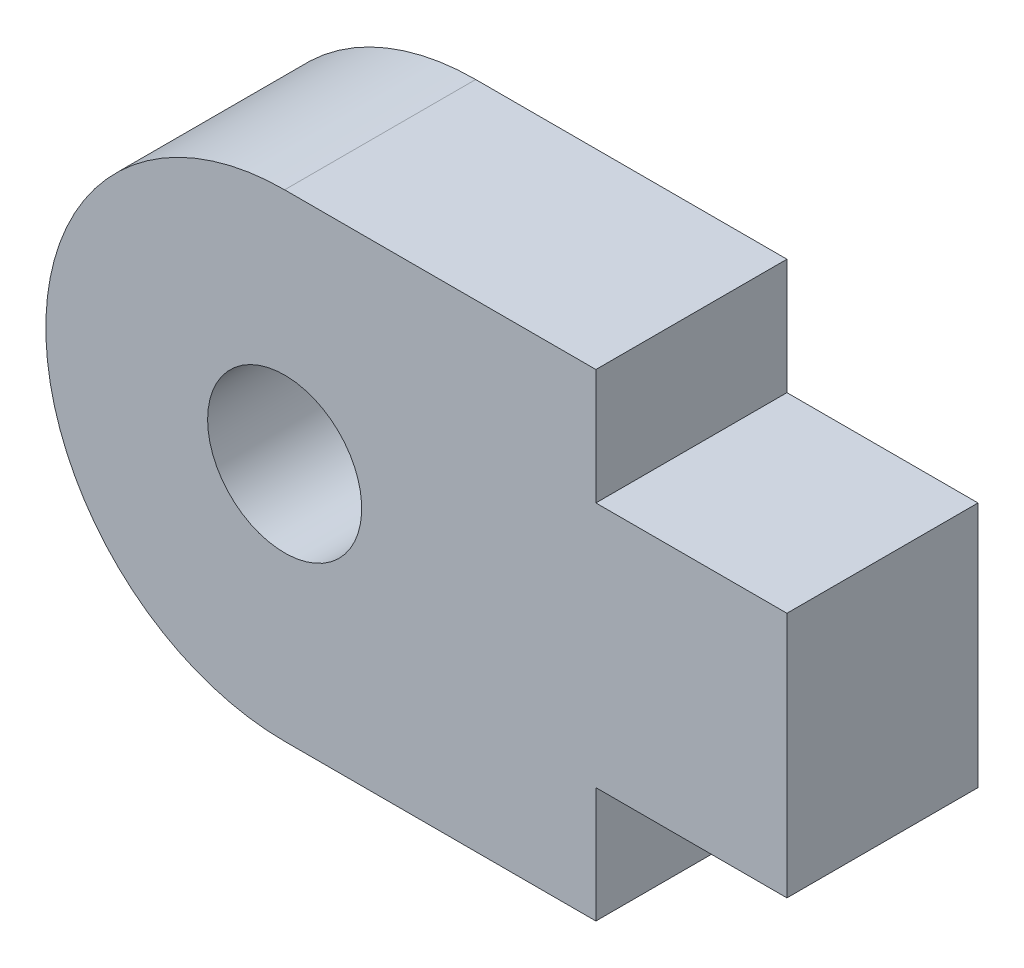
ISO-10303-21;
HEADER;
FILE_DESCRIPTION(('STEP AP214'),'2;1');
FILE_NAME('part.step','',(''),(''),'','','');
FILE_SCHEMA(('AUTOMOTIVE_DESIGN { 1 0 10303 214 1 1 1 1 }'));
ENDSEC;
DATA;
#1=APPLICATION_CONTEXT('core data for automotive mechanical design processes');
#2=APPLICATION_PROTOCOL_DEFINITION('international standard','automotive_design',2000,#1);
#3=PRODUCT_CONTEXT('',#1,'mechanical');
#4=PRODUCT('Part','Part','',(#3));
#5=PRODUCT_RELATED_PRODUCT_CATEGORY('part','',(#4));
#6=PRODUCT_DEFINITION_FORMATION('','',#4);
#7=PRODUCT_DEFINITION_CONTEXT('part definition',#1,'design');
#8=PRODUCT_DEFINITION('design','',#6,#7);
#9=PRODUCT_DEFINITION_SHAPE('','',#8);
#10=(LENGTH_UNIT() NAMED_UNIT(*) SI_UNIT(.MILLI.,.METRE.));
#11=(NAMED_UNIT(*) PLANE_ANGLE_UNIT() SI_UNIT($,.RADIAN.));
#12=(NAMED_UNIT(*) SI_UNIT($,.STERADIAN.) SOLID_ANGLE_UNIT());
#13=UNCERTAINTY_MEASURE_WITH_UNIT(LENGTH_MEASURE(1.E-05),#10,'distance_accuracy_value','');
#14=(GEOMETRIC_REPRESENTATION_CONTEXT(3) GLOBAL_UNCERTAINTY_ASSIGNED_CONTEXT((#13)) GLOBAL_UNIT_ASSIGNED_CONTEXT((#10,
#11,#12)) REPRESENTATION_CONTEXT('',''));
#15=CARTESIAN_POINT('',(0.,0.,0.));
#16=DIRECTION('',(0.,0.,1.));
#17=DIRECTION('',(1.,0.,0.));
#18=AXIS2_PLACEMENT_3D('',#15,#16,#17);
#19=CARTESIAN_POINT('',(-24.2418020541136,9.39172814388467,3.1));
#20=DIRECTION('',(0.,0.,1.));
#21=DIRECTION('',(1.,0.,0.));
#22=AXIS2_PLACEMENT_3D('',#19,#20,#21);
#23=PLANE('',#22);
#24=DIRECTION('',(0.,1.,0.));
#25=VECTOR('',#24,1.);
#26=CARTESIAN_POINT('',(-16.0918020541136,7.39172814388467,3.1));
#27=LINE('',#26,#25);
#28=CARTESIAN_POINT('',(-16.0918020541136,7.39172814388467,3.1));
#29=VERTEX_POINT('',#28);
#30=CARTESIAN_POINT('',(-16.0918020541136,11.3917281438847,3.1));
#31=VERTEX_POINT('',#30);
#32=EDGE_CURVE('E143',#29,#31,#27,.T.);
#33=ORIENTED_EDGE('',*,*,#32,.T.);
#34=DIRECTION('',(-1.,0.,0.));
#35=VECTOR('',#34,1.);
#36=CARTESIAN_POINT('',(-19.1918020541136,11.3917281438847,3.1));
#37=LINE('',#36,#35);
#38=CARTESIAN_POINT('',(-19.1918020541136,11.3917281438847,3.1));
#39=VERTEX_POINT('',#38);
#40=EDGE_CURVE('E91',#31,#39,#37,.T.);
#41=ORIENTED_EDGE('',*,*,#40,.T.);
#42=DIRECTION('',(0.,1.,0.));
#43=VECTOR('',#42,1.);
#44=CARTESIAN_POINT('',(-19.1918020541136,13.2667281438847,3.1));
#45=LINE('',#44,#43);
#46=CARTESIAN_POINT('',(-19.1918020541136,13.2667281438847,3.1));
#47=VERTEX_POINT('',#46);
#48=EDGE_CURVE('E158',#39,#47,#45,.T.);
#49=ORIENTED_EDGE('',*,*,#48,.T.);
#50=DIRECTION('',(-1.,0.,0.));
#51=VECTOR('',#50,1.);
#52=CARTESIAN_POINT('',(-24.2418020541136,13.2667281438847,3.1));
#53=LINE('',#52,#51);
#54=CARTESIAN_POINT('',(-24.2418020541136,13.2667281438847,3.1));
#55=VERTEX_POINT('',#54);
#56=EDGE_CURVE('E171',#47,#55,#53,.T.);
#57=ORIENTED_EDGE('',*,*,#56,.T.);
#58=CARTESIAN_POINT('',(-24.2418020541136,9.39172814388467,3.1));
#59=DIRECTION('',(0.,0.,1.));
#60=DIRECTION('',(1.,0.,0.));
#61=AXIS2_PLACEMENT_3D('',#58,#59,#60);
#62=CIRCLE('',#61,3.875);
#63=CARTESIAN_POINT('',(-24.2418020541136,5.51672814388467,3.1));
#64=VERTEX_POINT('',#63);
#65=EDGE_CURVE('E110',#55,#64,#62,.T.);
#66=ORIENTED_EDGE('',*,*,#65,.T.);
#67=DIRECTION('',(1.,0.,0.));
#68=VECTOR('',#67,1.);
#69=CARTESIAN_POINT('',(-19.1918020541136,5.51672814388468,3.1));
#70=LINE('',#69,#68);
#71=CARTESIAN_POINT('',(-19.1918020541136,5.51672814388468,3.1));
#72=VERTEX_POINT('',#71);
#73=EDGE_CURVE('E104',#64,#72,#70,.T.);
#74=ORIENTED_EDGE('',*,*,#73,.T.);
#75=DIRECTION('',(0.,1.,0.));
#76=VECTOR('',#75,1.);
#77=CARTESIAN_POINT('',(-19.1918020541136,7.39172814388467,3.1));
#78=LINE('',#77,#76);
#79=CARTESIAN_POINT('',(-19.1918020541136,7.39172814388467,3.1));
#80=VERTEX_POINT('',#79);
#81=EDGE_CURVE('E108',#72,#80,#78,.T.);
#82=ORIENTED_EDGE('',*,*,#81,.T.);
#83=DIRECTION('',(1.,0.,0.));
#84=VECTOR('',#83,1.);
#85=CARTESIAN_POINT('',(-19.1918020541136,7.39172814388467,3.1));
#86=LINE('',#85,#84);
#87=EDGE_CURVE('E48',#80,#29,#86,.T.);
#88=ORIENTED_EDGE('',*,*,#87,.T.);
#89=EDGE_LOOP('',(#33,#41,#49,#57,#66,#74,#82,#88));
#90=FACE_BOUND('',#89,.T.);
#91=CARTESIAN_POINT('',(-24.2418020541136,9.41426949611614,3.1));
#92=DIRECTION('',(0.,0.,1.));
#93=DIRECTION('',(-1.,0.,0.));
#94=AXIS2_PLACEMENT_3D('',#91,#92,#93);
#95=CIRCLE('',#94,1.25);
#96=CARTESIAN_POINT('',(-25.4918020541136,9.41426949611614,3.1));
#97=VERTEX_POINT('',#96);
#98=EDGE_CURVE('E132',#97,#97,#95,.T.);
#99=ORIENTED_EDGE('',*,*,#98,.F.);
#100=EDGE_LOOP('',(#99));
#101=FACE_BOUND('',#100,.T.);
#102=ADVANCED_FACE('F31',(#90,#101),#23,.T.);
#103=CARTESIAN_POINT('',(-24.2418020541136,9.39172814388467,0.));
#104=DIRECTION('',(0.,0.,1.));
#105=DIRECTION('',(1.,0.,0.));
#106=AXIS2_PLACEMENT_3D('',#103,#104,#105);
#107=PLANE('',#106);
#108=DIRECTION('',(0.,1.,0.));
#109=VECTOR('',#108,1.);
#110=CARTESIAN_POINT('',(-16.0918020541136,7.39172814388467,0.));
#111=LINE('',#110,#109);
#112=CARTESIAN_POINT('',(-16.0918020541136,7.39172814388467,0.));
#113=VERTEX_POINT('',#112);
#114=CARTESIAN_POINT('',(-16.0918020541136,11.3917281438847,0.));
#115=VERTEX_POINT('',#114);
#116=EDGE_CURVE('E128',#113,#115,#111,.T.);
#117=ORIENTED_EDGE('',*,*,#116,.F.);
#118=DIRECTION('',(1.,0.,0.));
#119=VECTOR('',#118,1.);
#120=CARTESIAN_POINT('',(-19.1918020541136,7.39172814388467,0.));
#121=LINE('',#120,#119);
#122=CARTESIAN_POINT('',(-19.1918020541136,7.39172814388467,0.));
#123=VERTEX_POINT('',#122);
#124=EDGE_CURVE('E83',#123,#113,#121,.T.);
#125=ORIENTED_EDGE('',*,*,#124,.F.);
#126=DIRECTION('',(0.,1.,0.));
#127=VECTOR('',#126,1.);
#128=CARTESIAN_POINT('',(-19.1918020541136,7.39172814388467,0.));
#129=LINE('',#128,#127);
#130=CARTESIAN_POINT('',(-19.1918020541136,5.51672814388468,0.));
#131=VERTEX_POINT('',#130);
#132=EDGE_CURVE('E77',#131,#123,#129,.T.);
#133=ORIENTED_EDGE('',*,*,#132,.F.);
#134=DIRECTION('',(1.,0.,0.));
#135=VECTOR('',#134,1.);
#136=CARTESIAN_POINT('',(-19.1918020541136,5.51672814388468,0.));
#137=LINE('',#136,#135);
#138=CARTESIAN_POINT('',(-24.2418020541136,5.51672814388467,0.));
#139=VERTEX_POINT('',#138);
#140=EDGE_CURVE('E118',#139,#131,#137,.T.);
#141=ORIENTED_EDGE('',*,*,#140,.F.);
#142=CARTESIAN_POINT('',(-24.2418020541136,9.39172814388467,0.));
#143=DIRECTION('',(0.,0.,1.));
#144=DIRECTION('',(1.,0.,0.));
#145=AXIS2_PLACEMENT_3D('',#142,#143,#144);
#146=CIRCLE('',#145,3.875);
#147=CARTESIAN_POINT('',(-24.2418020541136,13.2667281438847,0.));
#148=VERTEX_POINT('',#147);
#149=EDGE_CURVE('E138',#148,#139,#146,.T.);
#150=ORIENTED_EDGE('',*,*,#149,.F.);
#151=DIRECTION('',(-1.,0.,0.));
#152=VECTOR('',#151,1.);
#153=CARTESIAN_POINT('',(-24.2418020541136,13.2667281438847,0.));
#154=LINE('',#153,#152);
#155=CARTESIAN_POINT('',(-19.1918020541136,13.2667281438847,0.));
#156=VERTEX_POINT('',#155);
#157=EDGE_CURVE('E136',#156,#148,#154,.T.);
#158=ORIENTED_EDGE('',*,*,#157,.F.);
#159=DIRECTION('',(0.,1.,0.));
#160=VECTOR('',#159,1.);
#161=CARTESIAN_POINT('',(-19.1918020541136,13.2667281438847,0.));
#162=LINE('',#161,#160);
#163=CARTESIAN_POINT('',(-19.1918020541136,11.3917281438847,0.));
#164=VERTEX_POINT('',#163);
#165=EDGE_CURVE('E134',#164,#156,#162,.T.);
#166=ORIENTED_EDGE('',*,*,#165,.F.);
#167=DIRECTION('',(-1.,0.,0.));
#168=VECTOR('',#167,1.);
#169=CARTESIAN_POINT('',(-19.1918020541136,11.3917281438847,0.));
#170=LINE('',#169,#168);
#171=EDGE_CURVE('E131',#115,#164,#170,.T.);
#172=ORIENTED_EDGE('',*,*,#171,.F.);
#173=EDGE_LOOP('',(#117,#125,#133,#141,#150,#158,#166,#172));
#174=FACE_BOUND('',#173,.T.);
#175=CARTESIAN_POINT('',(-24.2418020541136,9.41426949611614,0.));
#176=DIRECTION('',(0.,0.,1.));
#177=DIRECTION('',(-1.,0.,0.));
#178=AXIS2_PLACEMENT_3D('',#175,#176,#177);
#179=CIRCLE('',#178,1.25);
#180=CARTESIAN_POINT('',(-25.4918020541136,9.41426949611614,0.));
#181=VERTEX_POINT('',#180);
#182=EDGE_CURVE('E177',#181,#181,#179,.T.);
#183=ORIENTED_EDGE('',*,*,#182,.T.);
#184=EDGE_LOOP('',(#183));
#185=FACE_BOUND('',#184,.T.);
#186=ADVANCED_FACE('F162',(#174,#185),#107,.F.);
#187=CARTESIAN_POINT('',(-16.0918020541136,7.39172814388467,3.1));
#188=DIRECTION('',(-1.,0.,0.));
#189=DIRECTION('',(0.,0.,1.));
#190=AXIS2_PLACEMENT_3D('',#187,#188,#189);
#191=PLANE('',#190);
#192=ORIENTED_EDGE('',*,*,#116,.T.);
#193=DIRECTION('',(0.,0.,-1.));
#194=VECTOR('',#193,1.);
#195=CARTESIAN_POINT('',(-16.0918020541136,11.3917281438847,3.1));
#196=LINE('',#195,#194);
#197=EDGE_CURVE('E11',#31,#115,#196,.T.);
#198=ORIENTED_EDGE('',*,*,#197,.F.);
#199=ORIENTED_EDGE('',*,*,#32,.F.);
#200=DIRECTION('',(0.,0.,-1.));
#201=VECTOR('',#200,1.);
#202=CARTESIAN_POINT('',(-16.0918020541136,7.39172814388467,3.1));
#203=LINE('',#202,#201);
#204=EDGE_CURVE('E124',#29,#113,#203,.T.);
#205=ORIENTED_EDGE('',*,*,#204,.T.);
#206=EDGE_LOOP('',(#192,#198,#199,#205));
#207=FACE_BOUND('',#206,.T.);
#208=ADVANCED_FACE('F33',(#207),#191,.F.);
#209=CARTESIAN_POINT('',(-19.1918020541136,11.3917281438847,3.1));
#210=DIRECTION('',(0.,-1.,0.));
#211=DIRECTION('',(0.,0.,-1.));
#212=AXIS2_PLACEMENT_3D('',#209,#210,#211);
#213=PLANE('',#212);
#214=ORIENTED_EDGE('',*,*,#171,.T.);
#215=DIRECTION('',(0.,0.,-1.));
#216=VECTOR('',#215,1.);
#217=CARTESIAN_POINT('',(-19.1918020541136,11.3917281438847,3.1));
#218=LINE('',#217,#216);
#219=EDGE_CURVE('E40',#39,#164,#218,.T.);
#220=ORIENTED_EDGE('',*,*,#219,.F.);
#221=ORIENTED_EDGE('',*,*,#40,.F.);
#222=ORIENTED_EDGE('',*,*,#197,.T.);
#223=EDGE_LOOP('',(#214,#220,#221,#222));
#224=FACE_BOUND('',#223,.T.);
#225=ADVANCED_FACE('F205',(#224),#213,.F.);
#226=CARTESIAN_POINT('',(-19.1918020541136,13.2667281438847,3.1));
#227=DIRECTION('',(-1.,0.,0.));
#228=DIRECTION('',(0.,0.,1.));
#229=AXIS2_PLACEMENT_3D('',#226,#227,#228);
#230=PLANE('',#229);
#231=ORIENTED_EDGE('',*,*,#165,.T.);
#232=DIRECTION('',(0.,0.,-1.));
#233=VECTOR('',#232,1.);
#234=CARTESIAN_POINT('',(-19.1918020541136,13.2667281438847,3.1));
#235=LINE('',#234,#233);
#236=EDGE_CURVE('E150',#47,#156,#235,.T.);
#237=ORIENTED_EDGE('',*,*,#236,.F.);
#238=ORIENTED_EDGE('',*,*,#48,.F.);
#239=ORIENTED_EDGE('',*,*,#219,.T.);
#240=EDGE_LOOP('',(#231,#237,#238,#239));
#241=FACE_BOUND('',#240,.T.);
#242=ADVANCED_FACE('F156',(#241),#230,.F.);
#243=CARTESIAN_POINT('',(-24.2418020541136,13.2667281438847,3.1));
#244=DIRECTION('',(0.,-1.,0.));
#245=DIRECTION('',(0.,0.,-1.));
#246=AXIS2_PLACEMENT_3D('',#243,#244,#245);
#247=PLANE('',#246);
#248=ORIENTED_EDGE('',*,*,#157,.T.);
#249=DIRECTION('',(0.,0.,-1.));
#250=VECTOR('',#249,1.);
#251=CARTESIAN_POINT('',(-24.2418020541136,13.2667281438847,3.1));
#252=LINE('',#251,#250);
#253=EDGE_CURVE('E147',#55,#148,#252,.T.);
#254=ORIENTED_EDGE('',*,*,#253,.F.);
#255=ORIENTED_EDGE('',*,*,#56,.F.);
#256=ORIENTED_EDGE('',*,*,#236,.T.);
#257=EDGE_LOOP('',(#248,#254,#255,#256));
#258=FACE_BOUND('',#257,.T.);
#259=ADVANCED_FACE('F167',(#258),#247,.F.);
#260=CARTESIAN_POINT('',(-24.2418020541136,9.39172814388467,3.1));
#261=DIRECTION('',(0.,0.,-1.));
#262=DIRECTION('',(-1.,0.,0.));
#263=AXIS2_PLACEMENT_3D('',#260,#261,#262);
#264=CYLINDRICAL_SURFACE('',#263,3.875);
#265=ORIENTED_EDGE('',*,*,#149,.T.);
#266=DIRECTION('',(0.,0.,-1.));
#267=VECTOR('',#266,1.);
#268=CARTESIAN_POINT('',(-24.2418020541136,5.51672814388467,3.1));
#269=LINE('',#268,#267);
#270=EDGE_CURVE('E119',#64,#139,#269,.T.);
#271=ORIENTED_EDGE('',*,*,#270,.F.);
#272=ORIENTED_EDGE('',*,*,#65,.F.);
#273=ORIENTED_EDGE('',*,*,#253,.T.);
#274=EDGE_LOOP('',(#265,#271,#272,#273));
#275=FACE_BOUND('',#274,.T.);
#276=ADVANCED_FACE('F170',(#275),#264,.T.);
#277=CARTESIAN_POINT('',(-19.1918020541136,5.51672814388468,3.1));
#278=DIRECTION('',(0.,1.,0.));
#279=DIRECTION('',(0.,0.,1.));
#280=AXIS2_PLACEMENT_3D('',#277,#278,#279);
#281=PLANE('',#280);
#282=ORIENTED_EDGE('',*,*,#140,.T.);
#283=DIRECTION('',(0.,0.,-1.));
#284=VECTOR('',#283,1.);
#285=CARTESIAN_POINT('',(-19.1918020541136,5.51672814388468,3.1));
#286=LINE('',#285,#284);
#287=EDGE_CURVE('E115',#72,#131,#286,.T.);
#288=ORIENTED_EDGE('',*,*,#287,.F.);
#289=ORIENTED_EDGE('',*,*,#73,.F.);
#290=ORIENTED_EDGE('',*,*,#270,.T.);
#291=EDGE_LOOP('',(#282,#288,#289,#290));
#292=FACE_BOUND('',#291,.T.);
#293=ADVANCED_FACE('F116',(#292),#281,.F.);
#294=CARTESIAN_POINT('',(-19.1918020541136,7.39172814388467,3.1));
#295=DIRECTION('',(-1.,0.,0.));
#296=DIRECTION('',(0.,0.,1.));
#297=AXIS2_PLACEMENT_3D('',#294,#295,#296);
#298=PLANE('',#297);
#299=ORIENTED_EDGE('',*,*,#132,.T.);
#300=DIRECTION('',(0.,0.,-1.));
#301=VECTOR('',#300,1.);
#302=CARTESIAN_POINT('',(-19.1918020541136,7.39172814388467,3.1));
#303=LINE('',#302,#301);
#304=EDGE_CURVE('E120',#80,#123,#303,.T.);
#305=ORIENTED_EDGE('',*,*,#304,.F.);
#306=ORIENTED_EDGE('',*,*,#81,.F.);
#307=ORIENTED_EDGE('',*,*,#287,.T.);
#308=EDGE_LOOP('',(#299,#305,#306,#307));
#309=FACE_BOUND('',#308,.T.);
#310=ADVANCED_FACE('F122',(#309),#298,.F.);
#311=CARTESIAN_POINT('',(-19.1918020541136,7.39172814388467,3.1));
#312=DIRECTION('',(0.,1.,0.));
#313=DIRECTION('',(0.,0.,1.));
#314=AXIS2_PLACEMENT_3D('',#311,#312,#313);
#315=PLANE('',#314);
#316=ORIENTED_EDGE('',*,*,#124,.T.);
#317=ORIENTED_EDGE('',*,*,#204,.F.);
#318=ORIENTED_EDGE('',*,*,#87,.F.);
#319=ORIENTED_EDGE('',*,*,#304,.T.);
#320=EDGE_LOOP('',(#316,#317,#318,#319));
#321=FACE_BOUND('',#320,.T.);
#322=ADVANCED_FACE('F193',(#321),#315,.F.);
#323=CARTESIAN_POINT('',(-24.2418020541136,9.41426949611614,3.1));
#324=DIRECTION('',(0.,0.,-1.));
#325=DIRECTION('',(-1.,0.,0.));
#326=AXIS2_PLACEMENT_3D('',#323,#324,#325);
#327=CYLINDRICAL_SURFACE('',#326,1.25);
#328=CARTESIAN_POINT('',(-25.4918020541136,9.41426949611614,3.1));
#329=CARTESIAN_POINT('',(-25.4918020541136,9.41426949611614,3.06770833333333));
#330=CARTESIAN_POINT('',(-25.4918020541136,9.41426949611614,3.03541666666667));
#331=CARTESIAN_POINT('',(-25.4918020541136,9.41426949611614,2.97083333333333));
#332=CARTESIAN_POINT('',(-25.4918020541136,9.41426949611614,2.93854166666667));
#333=CARTESIAN_POINT('',(-25.4918020541136,9.41426949611614,2.87395833333333));
#334=CARTESIAN_POINT('',(-25.4918020541136,9.41426949611614,2.84166666666667));
#335=CARTESIAN_POINT('',(-25.4918020541136,9.41426949611614,2.77708333333333));
#336=CARTESIAN_POINT('',(-25.4918020541136,9.41426949611614,2.74479166666667));
#337=CARTESIAN_POINT('',(-25.4918020541136,9.41426949611614,2.68020833333333));
#338=CARTESIAN_POINT('',(-25.4918020541136,9.41426949611614,2.64791666666667));
#339=CARTESIAN_POINT('',(-25.4918020541136,9.41426949611614,2.58333333333333));
#340=CARTESIAN_POINT('',(-25.4918020541136,9.41426949611614,2.55104166666667));
#341=CARTESIAN_POINT('',(-25.4918020541136,9.41426949611614,2.48645833333333));
#342=CARTESIAN_POINT('',(-25.4918020541136,9.41426949611614,2.45416666666667));
#343=CARTESIAN_POINT('',(-25.4918020541136,9.41426949611614,2.38958333333333));
#344=CARTESIAN_POINT('',(-25.4918020541136,9.41426949611614,2.35729166666667));
#345=CARTESIAN_POINT('',(-25.4918020541136,9.41426949611614,2.29270833333333));
#346=CARTESIAN_POINT('',(-25.4918020541136,9.41426949611614,2.26041666666667));
#347=CARTESIAN_POINT('',(-25.4918020541136,9.41426949611614,2.19583333333333));
#348=CARTESIAN_POINT('',(-25.4918020541136,9.41426949611614,2.16354166666667));
#349=CARTESIAN_POINT('',(-25.4918020541136,9.41426949611614,2.09895833333333));
#350=CARTESIAN_POINT('',(-25.4918020541136,9.41426949611614,2.06666666666667));
#351=CARTESIAN_POINT('',(-25.4918020541136,9.41426949611614,2.00208333333333));
#352=CARTESIAN_POINT('',(-25.4918020541136,9.41426949611614,1.96979166666667));
#353=CARTESIAN_POINT('',(-25.4918020541136,9.41426949611614,1.90520833333333));
#354=CARTESIAN_POINT('',(-25.4918020541136,9.41426949611614,1.87291666666667));
#355=CARTESIAN_POINT('',(-25.4918020541136,9.41426949611614,1.80833333333333));
#356=CARTESIAN_POINT('',(-25.4918020541136,9.41426949611614,1.77604166666667));
#357=CARTESIAN_POINT('',(-25.4918020541136,9.41426949611614,1.71145833333333));
#358=CARTESIAN_POINT('',(-25.4918020541136,9.41426949611614,1.67916666666667));
#359=CARTESIAN_POINT('',(-25.4918020541136,9.41426949611614,1.61458333333333));
#360=CARTESIAN_POINT('',(-25.4918020541136,9.41426949611614,1.58229166666667));
#361=CARTESIAN_POINT('',(-25.4918020541136,9.41426949611614,1.51770833333333));
#362=CARTESIAN_POINT('',(-25.4918020541136,9.41426949611614,1.48541666666667));
#363=CARTESIAN_POINT('',(-25.4918020541136,9.41426949611614,1.42083333333333));
#364=CARTESIAN_POINT('',(-25.4918020541136,9.41426949611614,1.38854166666667));
#365=CARTESIAN_POINT('',(-25.4918020541136,9.41426949611614,1.32395833333333));
#366=CARTESIAN_POINT('',(-25.4918020541136,9.41426949611614,1.29166666666667));
#367=CARTESIAN_POINT('',(-25.4918020541136,9.41426949611614,1.22708333333333));
#368=CARTESIAN_POINT('',(-25.4918020541136,9.41426949611614,1.19479166666667));
#369=CARTESIAN_POINT('',(-25.4918020541136,9.41426949611614,1.13020833333333));
#370=CARTESIAN_POINT('',(-25.4918020541136,9.41426949611614,1.09791666666667));
#371=CARTESIAN_POINT('',(-25.4918020541136,9.41426949611614,1.03333333333333));
#372=CARTESIAN_POINT('',(-25.4918020541136,9.41426949611614,1.00104166666667));
#373=CARTESIAN_POINT('',(-25.4918020541136,9.41426949611614,0.936458333333333));
#374=CARTESIAN_POINT('',(-25.4918020541136,9.41426949611614,0.904166666666667));
#375=CARTESIAN_POINT('',(-25.4918020541136,9.41426949611614,0.839583333333333));
#376=CARTESIAN_POINT('',(-25.4918020541136,9.41426949611614,0.807291666666667));
#377=CARTESIAN_POINT('',(-25.4918020541136,9.41426949611614,0.742708333333333));
#378=CARTESIAN_POINT('',(-25.4918020541136,9.41426949611614,0.710416666666667));
#379=CARTESIAN_POINT('',(-25.4918020541136,9.41426949611614,0.645833333333333));
#380=CARTESIAN_POINT('',(-25.4918020541136,9.41426949611614,0.613541666666667));
#381=CARTESIAN_POINT('',(-25.4918020541136,9.41426949611614,0.548958333333333));
#382=CARTESIAN_POINT('',(-25.4918020541136,9.41426949611614,0.516666666666667));
#383=CARTESIAN_POINT('',(-25.4918020541136,9.41426949611614,0.452083333333333));
#384=CARTESIAN_POINT('',(-25.4918020541136,9.41426949611614,0.419791666666667));
#385=CARTESIAN_POINT('',(-25.4918020541136,9.41426949611614,0.355208333333333));
#386=CARTESIAN_POINT('',(-25.4918020541136,9.41426949611614,0.322916666666667));
#387=CARTESIAN_POINT('',(-25.4918020541136,9.41426949611614,0.258333333333333));
#388=CARTESIAN_POINT('',(-25.4918020541136,9.41426949611614,0.226041666666667));
#389=CARTESIAN_POINT('',(-25.4918020541136,9.41426949611614,0.161458333333333));
#390=CARTESIAN_POINT('',(-25.4918020541136,9.41426949611614,0.129166666666667));
#391=CARTESIAN_POINT('',(-25.4918020541136,9.41426949611614,0.0645833333333335));
#392=CARTESIAN_POINT('',(-25.4918020541136,9.41426949611614,0.0322916666666667));
#393=CARTESIAN_POINT('',(-25.4918020541136,9.41426949611614,0.));
#394=B_SPLINE_CURVE_WITH_KNOTS('',3,(#328,#329,#330,#331,#332,#333,#334,#335,#336,#337,#338,
#339,#340,#341,#342,#343,#344,#345,#346,#347,#348,#349,#350,#351,#352,#353,#354,#355,#356,#357,
#358,#359,#360,#361,#362,#363,#364,#365,#366,#367,#368,#369,#370,#371,#372,#373,#374,#375,#376,
#377,#378,#379,#380,#381,#382,#383,#384,#385,#386,#387,#388,#389,#390,#391,#392,#393),
.UNSPECIFIED.,.F.,.F.,(4,2,2,2,2,2,2,2,2,2,2,2,2,2,2,2,2,2,2,2,2,2,2,2,2,2,2,2,2,2,2,2,4),(0.,
0.0968749999999997,0.19375,0.290625,0.3875,0.484375,0.58125,0.678125,0.775,0.871874999999999,
0.96875,1.065625,1.1625,1.259375,1.35625,1.453125,1.55,1.646875,1.74375,1.840625,1.9375,
2.034375,2.13125,2.228125,2.325,2.421875,2.51875,2.615625,2.7125,2.809375,2.90625,3.003125,3.1),.UNSPECIFIED.);
#395=EDGE_CURVE('BSEAM183',#97,#181,#394,.T.);
#396=ORIENTED_EDGE('',*,*,#98,.T.);
#397=ORIENTED_EDGE('',*,*,#182,.F.);
#398=ORIENTED_EDGE('',*,*,#395,.T.);
#399=ORIENTED_EDGE('',*,*,#395,.F.);
#400=EDGE_LOOP('',(#396,#398,#397,#399));
#401=FACE_BOUND('',#400,.T.);
#402=ADVANCED_FACE('F183',(#401),#327,.F.);
#403=CLOSED_SHELL('',(#102,#186,#208,#225,#242,#259,#276,#293,#310,#322,#402));
#404=MANIFOLD_SOLID_BREP('B2',#403);
#405=ADVANCED_BREP_SHAPE_REPRESENTATION('',(#18,#404),#14);
#406=SHAPE_DEFINITION_REPRESENTATION(#9,#405);
ENDSEC;
END-ISO-10303-21;
